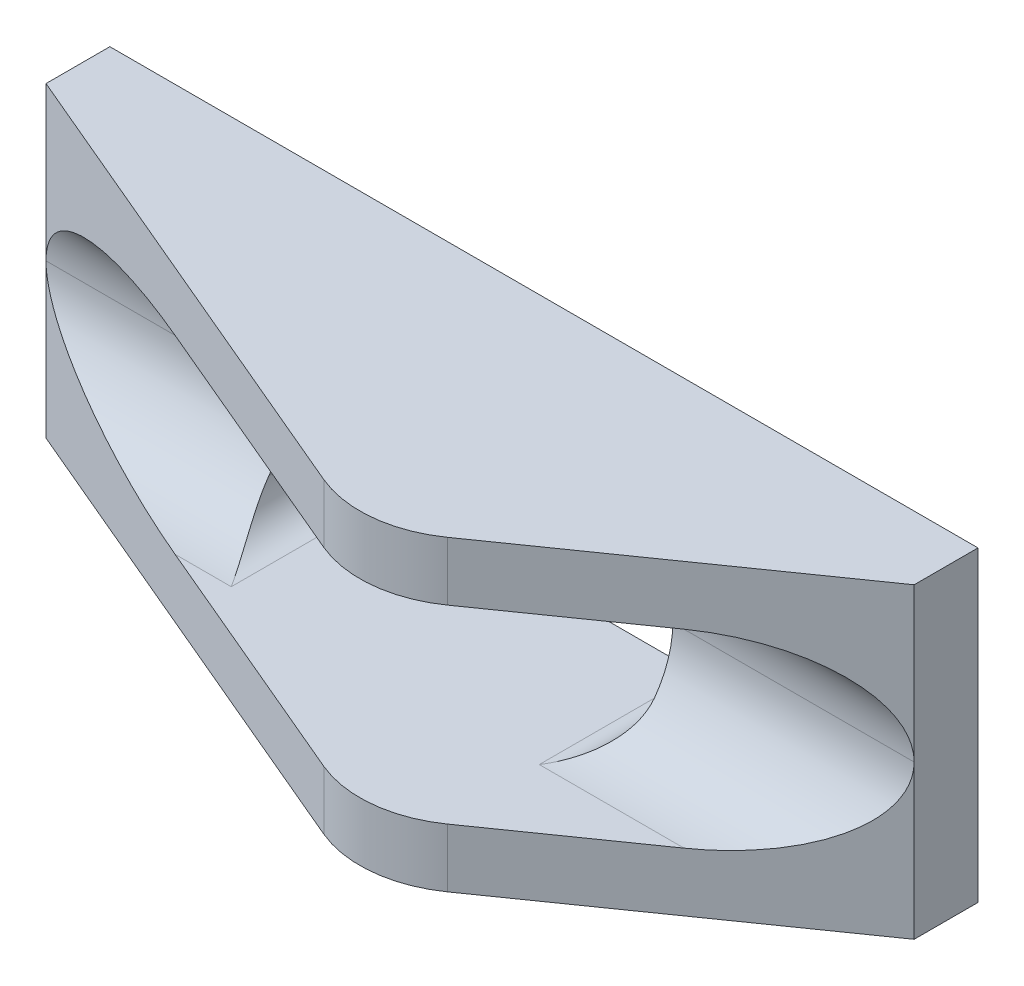
ISO-10303-21;
HEADER;
FILE_DESCRIPTION(('STEP AP214'),'2;1');
FILE_NAME('part.step','',(''),(''),'','','');
FILE_SCHEMA(('AUTOMOTIVE_DESIGN { 1 0 10303 214 1 1 1 1 }'));
ENDSEC;
DATA;
#1=APPLICATION_CONTEXT('core data for automotive mechanical design processes');
#2=APPLICATION_PROTOCOL_DEFINITION('international standard','automotive_design',2000,#1);
#3=PRODUCT_CONTEXT('',#1,'mechanical');
#4=PRODUCT('Part','Part','',(#3));
#5=PRODUCT_RELATED_PRODUCT_CATEGORY('part','',(#4));
#6=PRODUCT_DEFINITION_FORMATION('','',#4);
#7=PRODUCT_DEFINITION_CONTEXT('part definition',#1,'design');
#8=PRODUCT_DEFINITION('design','',#6,#7);
#9=PRODUCT_DEFINITION_SHAPE('','',#8);
#10=(LENGTH_UNIT() NAMED_UNIT(*) SI_UNIT(.MILLI.,.METRE.));
#11=(NAMED_UNIT(*) PLANE_ANGLE_UNIT() SI_UNIT($,.RADIAN.));
#12=(NAMED_UNIT(*) SI_UNIT($,.STERADIAN.) SOLID_ANGLE_UNIT());
#13=UNCERTAINTY_MEASURE_WITH_UNIT(LENGTH_MEASURE(1.E-05),#10,'distance_accuracy_value','');
#14=(GEOMETRIC_REPRESENTATION_CONTEXT(3) GLOBAL_UNCERTAINTY_ASSIGNED_CONTEXT((#13)) GLOBAL_UNIT_ASSIGNED_CONTEXT((#10,
#11,#12)) REPRESENTATION_CONTEXT('',''));
#15=CARTESIAN_POINT('',(0.,0.,0.));
#16=DIRECTION('',(0.,0.,1.));
#17=DIRECTION('',(1.,0.,0.));
#18=AXIS2_PLACEMENT_3D('',#15,#16,#17);
#19=CARTESIAN_POINT('',(0.,0.,-5.99738460468157));
#20=DIRECTION('',(1.,0.,0.));
#21=DIRECTION('',(0.,0.,-1.));
#22=AXIS2_PLACEMENT_3D('',#19,#20,#21);
#23=CYLINDRICAL_SURFACE('',#22,6.223);
#24=CARTESIAN_POINT('',(14.7510273618538,3.68299999999998,-11.013482689847));
#25=CARTESIAN_POINT('',(14.7510192398288,3.77062108702406,-10.9491729691934));
#26=CARTESIAN_POINT('',(14.7464960217351,3.8564633635951,-10.8825882655043));
#27=CARTESIAN_POINT('',(14.7294467336812,4.02394481183231,-10.7455647351371));
#28=CARTESIAN_POINT('',(14.7169349879002,4.10559122451816,-10.6751330128147));
#29=CARTESIAN_POINT('',(14.6850854044515,4.26357503702304,-10.5315834790002));
#30=CARTESIAN_POINT('',(14.6658156078275,4.33995659432102,-10.4584987230804));
#31=CARTESIAN_POINT('',(14.621301757878,4.48808495575234,-10.3094454186469));
#32=CARTESIAN_POINT('',(14.5960541294101,4.55982895350168,-10.2334751673308));
#33=CARTESIAN_POINT('',(14.5292211582923,4.72633143875333,-10.0481430735446));
#34=CARTESIAN_POINT('',(14.4851436261417,4.81878761882573,-9.93760299777665));
#35=CARTESIAN_POINT('',(14.3887158003018,4.99421767099625,-9.71274216603948));
#36=CARTESIAN_POINT('',(14.3363635895779,5.07718933807677,-9.59842053884507));
#37=CARTESIAN_POINT('',(14.1686097935668,5.31298900211726,-9.24959891914482));
#38=CARTESIAN_POINT('',(14.0429378749322,5.45172094746975,-9.01035135337723));
#39=CARTESIAN_POINT('',(13.8134420615749,5.65788943356936,-8.5956322631334));
#40=CARTESIAN_POINT('',(13.7139916473592,5.73430819661466,-8.42199308105781));
#41=CARTESIAN_POINT('',(13.5085078458643,5.87007700161003,-8.07179381515766));
#42=CARTESIAN_POINT('',(13.4024712717605,5.92941870106635,-7.89523234812532));
#43=CARTESIAN_POINT('',(13.1860494183576,6.03145074788007,-7.5405422503233));
#44=CARTESIAN_POINT('',(13.075673043595,6.07417341335729,-7.36241735701683));
#45=CARTESIAN_POINT('',(12.8520063669007,6.14357826112029,-7.00500017017672));
#46=CARTESIAN_POINT('',(12.7387176130706,6.17026878882132,-6.82570853320225));
#47=CARTESIAN_POINT('',(12.5574807493523,6.20018222309766,-6.54032458689748));
#48=CARTESIAN_POINT('',(12.4900280823434,6.20854152605513,-6.43442353797042));
#49=CARTESIAN_POINT('',(12.3548893274787,6.21982819100618,-6.22257084781105));
#50=CARTESIAN_POINT('',(12.2872034434071,6.2227594720158,-6.1166192983677));
#51=CARTESIAN_POINT('',(12.2166901202745,6.2229952651248,-6.00624822384881));
#52=CARTESIAN_POINT('',(12.2138587322994,6.22299999930855,-6.00181640071064));
#53=CARTESIAN_POINT('',(12.2110273618538,6.223,-5.99738460468157));
#54=B_SPLINE_CURVE_WITH_KNOTS('',3,(#24,#25,#26,#27,#28,#29,#30,#31,#32,#33,#34,#35,#36,#37,#38,
#39,#40,#41,#42,#43,#44,#45,#46,#47,#48,#49,#50,#51,#52,#53),.UNSPECIFIED.,.F.,.F.,(4,2,2,2,2,2,
2,2,2,2,2,2,2,2,4),(0.,0.325807359288605,0.651032149844112,0.973072326145553,1.29530559264606,
1.74670408642337,2.19820731155942,3.10578212670607,3.74768048443243,4.38989189232504,
5.03084810812777,5.6714703889397,6.04888277178355,6.4260225575829,6.44179976271333),.UNSPECIFIED.);
#55=CARTESIAN_POINT('',(12.2110273618538,6.223,-5.99738460468157));
#56=VERTEX_POINT('',#55);
#57=CARTESIAN_POINT('',(14.7510273618538,3.68299999999998,-11.013482689847));
#58=VERTEX_POINT('',#57);
#59=EDGE_CURVE('E11',#56,#58,#54,.F.);
#60=ORIENTED_EDGE('',*,*,#59,.T.);
#61=CARTESIAN_POINT('',(14.7510273618538,0.,-5.99738460468157));
#62=DIRECTION('',(1.,0.,0.));
#63=DIRECTION('',(0.,0.,-1.));
#64=AXIS2_PLACEMENT_3D('',#61,#62,#63);
#65=CIRCLE('',#64,6.223);
#66=CARTESIAN_POINT('',(14.7510273618538,0.,-12.2203846046816));
#67=VERTEX_POINT('',#66);
#68=EDGE_CURVE('E259',#58,#67,#65,.F.);
#69=ORIENTED_EDGE('',*,*,#68,.T.);
#70=DIRECTION('',(1.,0.,0.));
#71=VECTOR('',#70,1.);
#72=CARTESIAN_POINT('',(0.,0.,-12.2203846046816));
#73=LINE('',#72,#71);
#74=CARTESIAN_POINT('',(30.5942773618538,0.,-12.2203846046816));
#75=VERTEX_POINT('',#74);
#76=EDGE_CURVE('E280',#75,#67,#73,.F.);
#77=ORIENTED_EDGE('',*,*,#76,.F.);
#78=CARTESIAN_POINT('',(21.7104596303103,0.,-5.99738460468157));
#79=DIRECTION('',(-0.57373008714395,0.,-0.81904443536709));
#80=DIRECTION('',(0.81904443536709,0.,-0.57373008714395));
#81=AXIS2_PLACEMENT_3D('',#78,#79,#80);
#82=ELLIPSE('',#81,10.846563810133,6.223);
#83=CARTESIAN_POINT('',(21.7104596303103,6.223,-5.99738460468157));
#84=VERTEX_POINT('',#83);
#85=EDGE_CURVE('E370',#84,#75,#82,.T.);
#86=ORIENTED_EDGE('',*,*,#85,.F.);
#87=DIRECTION('',(1.,0.,0.));
#88=VECTOR('',#87,1.);
#89=CARTESIAN_POINT('',(0.,6.223,-5.99738460468157));
#90=LINE('',#89,#88);
#91=EDGE_CURVE('E358',#56,#84,#90,.T.);
#92=ORIENTED_EDGE('',*,*,#91,.F.);
#93=EDGE_LOOP('',(#60,#69,#77,#86,#92));
#94=FACE_BOUND('',#93,.T.);
#95=ADVANCED_FACE('F47',(#94),#23,.F.);
#96=CARTESIAN_POINT('',(0.,0.,-5.99738460468157));
#97=DIRECTION('',(-1.,0.,0.));
#98=DIRECTION('',(0.,0.,1.));
#99=AXIS2_PLACEMENT_3D('',#96,#97,#98);
#100=CYLINDRICAL_SURFACE('',#99,6.223);
#101=CARTESIAN_POINT('',(14.7510273618538,0.,-5.99738460468157));
#102=DIRECTION('',(1.,0.,0.));
#103=DIRECTION('',(0.,0.,-1.));
#104=AXIS2_PLACEMENT_3D('',#101,#102,#103);
#105=CIRCLE('',#104,6.223);
#106=CARTESIAN_POINT('',(14.7510273618538,-3.68299999999998,-11.013482689847));
#107=VERTEX_POINT('',#106);
#108=EDGE_CURVE('E410',#67,#107,#105,.F.);
#109=ORIENTED_EDGE('',*,*,#108,.T.);
#110=CARTESIAN_POINT('',(14.7510273618538,-3.68299999999998,-11.013482689847));
#111=CARTESIAN_POINT('',(14.7510192398288,-3.77062108702402,-10.9491729691934));
#112=CARTESIAN_POINT('',(14.7464960217351,-3.856463363595,-10.8825882655044));
#113=CARTESIAN_POINT('',(14.7294467336812,-4.02394481183212,-10.7455647351373));
#114=CARTESIAN_POINT('',(14.7169349879002,-4.10559122451792,-10.6751330128149));
#115=CARTESIAN_POINT('',(14.6850854044515,-4.26357503702282,-10.5315834790004));
#116=CARTESIAN_POINT('',(14.6658156078275,-4.33995659432085,-10.4584987230805));
#117=CARTESIAN_POINT('',(14.621301757878,-4.48808495575226,-10.309445418647));
#118=CARTESIAN_POINT('',(14.5960541294101,-4.55982895350164,-10.2334751673308));
#119=CARTESIAN_POINT('',(14.5292211582923,-4.72633143875337,-10.0481430735446));
#120=CARTESIAN_POINT('',(14.4851436261417,-4.8187876188258,-9.93760299777657));
#121=CARTESIAN_POINT('',(14.3887158003018,-4.99421767099636,-9.71274216603932));
#122=CARTESIAN_POINT('',(14.3363635895778,-5.07718933807691,-9.59842053884488));
#123=CARTESIAN_POINT('',(14.1686097935667,-5.31298900211736,-9.24959891914466));
#124=CARTESIAN_POINT('',(14.0429378749321,-5.4517209474698,-9.01035135337714));
#125=CARTESIAN_POINT('',(13.8134420615749,-5.65788943356935,-8.59563226313344));
#126=CARTESIAN_POINT('',(13.7139916473592,-5.73430819661462,-8.42199308105791));
#127=CARTESIAN_POINT('',(13.5085078458644,-5.87007700160997,-8.0717938151578));
#128=CARTESIAN_POINT('',(13.4024712717608,-5.92941870106628,-7.89523234812544));
#129=CARTESIAN_POINT('',(13.1860494183577,-6.03145074788003,-7.54054225032355));
#130=CARTESIAN_POINT('',(13.0756730435946,-6.07417341335727,-7.36241735701724));
#131=CARTESIAN_POINT('',(12.8520063669011,-6.14357826112028,-7.00500017017649));
#132=CARTESIAN_POINT('',(12.7387176130723,-6.17026878882132,-6.82570853320123));
#133=CARTESIAN_POINT('',(12.5574807493514,-6.20018222309767,-6.54032458689804));
#134=CARTESIAN_POINT('',(12.4900280823406,-6.20854152605514,-6.4344235379722));
#135=CARTESIAN_POINT('',(12.3548893274817,-6.21982819100618,-6.22257084780915));
#136=CARTESIAN_POINT('',(12.2872034434177,-6.22275947201579,-6.11661929836091));
#137=CARTESIAN_POINT('',(12.2166901202754,-6.2229952651248,-6.00624822384825));
#138=CARTESIAN_POINT('',(12.2138587322999,-6.22299999930855,-6.00181640071035));
#139=CARTESIAN_POINT('',(12.2110273618538,-6.223,-5.99738460468157));
#140=B_SPLINE_CURVE_WITH_KNOTS('',3,(#110,#111,#112,#113,#114,#115,#116,#117,#118,#119,#120,
#121,#122,#123,#124,#125,#126,#127,#128,#129,#130,#131,#132,#133,#134,#135,#136,#137,#138,#139),
.UNSPECIFIED.,.F.,.F.,(4,2,2,2,2,2,2,2,2,2,2,2,2,2,4),(0.,0.32580735928841,0.651032149843723,
0.973072326145361,1.29530559264606,1.74670408642352,2.19820731155972,3.10578212670607,
3.74768048443227,4.38989189232474,5.03084810812765,5.67147038893971,6.04888277178356,
6.42602255758289,6.44179976271333),.UNSPECIFIED.);
#141=CARTESIAN_POINT('',(12.2110273618538,-6.223,-5.99738460468157));
#142=VERTEX_POINT('',#141);
#143=EDGE_CURVE('E403',#107,#142,#140,.T.);
#144=ORIENTED_EDGE('',*,*,#143,.T.);
#145=DIRECTION('',(1.,0.,0.));
#146=VECTOR('',#145,1.);
#147=CARTESIAN_POINT('',(-26.3906226381462,-6.223,-5.99738460468157));
#148=LINE('',#147,#146);
#149=CARTESIAN_POINT('',(21.7104596303103,-6.223,-5.99738460468157));
#150=VERTEX_POINT('',#149);
#151=EDGE_CURVE('E355',#150,#142,#148,.F.);
#152=ORIENTED_EDGE('',*,*,#151,.F.);
#153=CARTESIAN_POINT('',(21.7104596303103,0.,-5.99738460468157));
#154=DIRECTION('',(-0.57373008714395,0.,-0.81904443536709));
#155=DIRECTION('',(-0.81904443536709,0.,0.57373008714395));
#156=AXIS2_PLACEMENT_3D('',#153,#154,#155);
#157=ELLIPSE('',#156,10.846563810133,6.223);
#158=EDGE_CURVE('E363',#75,#150,#157,.T.);
#159=ORIENTED_EDGE('',*,*,#158,.F.);
#160=ORIENTED_EDGE('',*,*,#76,.T.);
#161=EDGE_LOOP('',(#109,#144,#152,#159,#160));
#162=FACE_BOUND('',#161,.T.);
#163=ADVANCED_FACE('F398',(#162),#100,.F.);
#164=CARTESIAN_POINT('',(0.374754533700996,10.07745,-0.884869008015571));
#165=DIRECTION('',(0.389981438118863,0.,-0.920822717966245));
#166=DIRECTION('',(-0.920822717966245,0.,-0.389981438118863));
#167=AXIS2_PLACEMENT_3D('',#164,#165,#166);
#168=PLANE('',#167);
#169=DIRECTION('',(0.920822717966245,0.,0.389981438118863));
#170=VECTOR('',#169,1.);
#171=CARTESIAN_POINT('',(0.374754533700996,-6.223,-0.884869008015571));
#172=LINE('',#171,#170);
#173=CARTESIAN_POINT('',(-11.6968982354032,-6.223,-5.99738460468158));
#174=VERTEX_POINT('',#173);
#175=CARTESIAN_POINT('',(5.23632134698163,-6.223,1.17407326215507));
#176=VERTEX_POINT('',#175);
#177=EDGE_CURVE('E264',#174,#176,#172,.T.);
#178=ORIENTED_EDGE('',*,*,#177,.F.);
#179=CARTESIAN_POINT('',(-11.6968982354032,0.,-5.99738460468157));
#180=DIRECTION('',(0.389981438118863,0.,-0.920822717966245));
#181=DIRECTION('',(-0.920822717966245,0.,-0.389981438118863));
#182=AXIS2_PLACEMENT_3D('',#179,#180,#181);
#183=ELLIPSE('',#182,15.9571697309944,6.223);
#184=CARTESIAN_POINT('',(-26.3906226381462,0.,-12.2203846046816));
#185=VERTEX_POINT('',#184);
#186=EDGE_CURVE('E366',#174,#185,#183,.T.);
#187=ORIENTED_EDGE('',*,*,#186,.T.);
#188=DIRECTION('',(0.,-1.,0.));
#189=VECTOR('',#188,1.);
#190=CARTESIAN_POINT('',(-26.3906226381462,10.07745,-12.2203846046816));
#191=LINE('',#190,#189);
#192=CARTESIAN_POINT('',(-26.3906226381462,-10.07745,-12.2203846046816));
#193=VERTEX_POINT('',#192);
#194=EDGE_CURVE('E349',#185,#193,#191,.T.);
#195=ORIENTED_EDGE('',*,*,#194,.T.);
#196=DIRECTION('',(0.920822717966245,0.,0.389981438118863));
#197=VECTOR('',#196,1.);
#198=CARTESIAN_POINT('',(0.374754533700996,-10.07745,-0.884869008015571));
#199=LINE('',#198,#197);
#200=CARTESIAN_POINT('',(5.23632134698163,-10.07745,1.17407326215507));
#201=VERTEX_POINT('',#200);
#202=EDGE_CURVE('E311',#193,#201,#199,.T.);
#203=ORIENTED_EDGE('',*,*,#202,.T.);
#204=DIRECTION('',(0.,-1.,0.));
#205=VECTOR('',#204,1.);
#206=CARTESIAN_POINT('',(5.23632134698163,10.07745,1.17407326215507));
#207=LINE('',#206,#205);
#208=EDGE_CURVE('E344',#176,#201,#207,.T.);
#209=ORIENTED_EDGE('',*,*,#208,.F.);
#210=EDGE_LOOP('',(#178,#187,#195,#203,#209));
#211=FACE_BOUND('',#210,.T.);
#212=ADVANCED_FACE('F454',(#211),#168,.F.);
#213=CARTESIAN_POINT('',(8.2079799054474,10.07745,-5.8425958487477));
#214=DIRECTION('',(0.,-1.,0.));
#215=DIRECTION('',(0.,0.,-1.));
#216=AXIS2_PLACEMENT_3D('',#213,#214,#215);
#217=CYLINDRICAL_SURFACE('',#216,7.62);
#218=CARTESIAN_POINT('',(8.2079799054474,-6.223,-5.8425958487477));
#219=DIRECTION('',(0.,1.,0.));
#220=DIRECTION('',(0.,0.,1.));
#221=AXIS2_PLACEMENT_3D('',#218,#219,#220);
#222=CIRCLE('',#221,7.62);
#223=CARTESIAN_POINT('',(12.5798031694843,-6.223,0.398522748749506));
#224=VERTEX_POINT('',#223);
#225=EDGE_CURVE('E267',#176,#224,#222,.T.);
#226=ORIENTED_EDGE('',*,*,#225,.F.);
#227=ORIENTED_EDGE('',*,*,#208,.T.);
#228=CARTESIAN_POINT('',(8.2079799054474,-10.07745,-5.8425958487477));
#229=DIRECTION('',(0.,1.,0.));
#230=DIRECTION('',(0.,0.,1.));
#231=AXIS2_PLACEMENT_3D('',#228,#229,#230);
#232=CIRCLE('',#231,7.62);
#233=CARTESIAN_POINT('',(12.5798031694843,-10.07745,0.398522748749506));
#234=VERTEX_POINT('',#233);
#235=EDGE_CURVE('E315',#201,#234,#232,.T.);
#236=ORIENTED_EDGE('',*,*,#235,.T.);
#237=DIRECTION('',(0.,-1.,0.));
#238=VECTOR('',#237,1.);
#239=CARTESIAN_POINT('',(12.5798031694843,10.07745,0.398522748749506));
#240=LINE('',#239,#238);
#241=EDGE_CURVE('E339',#224,#234,#240,.T.);
#242=ORIENTED_EDGE('',*,*,#241,.F.);
#243=EDGE_LOOP('',(#226,#227,#236,#242));
#244=FACE_BOUND('',#243,.T.);
#245=ADVANCED_FACE('F451',(#244),#217,.T.);
#246=CARTESIAN_POINT('',(4.3281161665867,10.07745,6.17872330787448));
#247=DIRECTION('',(-0.57373008714395,0.,-0.81904443536709));
#248=DIRECTION('',(-0.81904443536709,0.,0.57373008714395));
#249=AXIS2_PLACEMENT_3D('',#246,#247,#248);
#250=PLANE('',#249);
#251=DIRECTION('',(0.81904443536709,0.,-0.57373008714395));
#252=VECTOR('',#251,1.);
#253=CARTESIAN_POINT('',(4.3281161665867,-6.223,6.17872330787448));
#254=LINE('',#253,#252);
#255=EDGE_CURVE('E271',#224,#150,#254,.T.);
#256=ORIENTED_EDGE('',*,*,#255,.F.);
#257=ORIENTED_EDGE('',*,*,#241,.T.);
#258=DIRECTION('',(0.81904443536709,0.,-0.57373008714395));
#259=VECTOR('',#258,1.);
#260=CARTESIAN_POINT('',(4.3281161665867,-10.07745,6.17872330787448));
#261=LINE('',#260,#259);
#262=CARTESIAN_POINT('',(30.5942773618538,-10.07745,-12.2203846046816));
#263=VERTEX_POINT('',#262);
#264=EDGE_CURVE('E319',#234,#263,#261,.T.);
#265=ORIENTED_EDGE('',*,*,#264,.T.);
#266=DIRECTION('',(0.,-1.,0.));
#267=VECTOR('',#266,1.);
#268=CARTESIAN_POINT('',(30.5942773618538,10.07745,-12.2203846046816));
#269=LINE('',#268,#267);
#270=EDGE_CURVE('E335',#75,#263,#269,.T.);
#271=ORIENTED_EDGE('',*,*,#270,.F.);
#272=ORIENTED_EDGE('',*,*,#158,.T.);
#273=EDGE_LOOP('',(#256,#257,#265,#271,#272));
#274=FACE_BOUND('',#273,.T.);
#275=ADVANCED_FACE('F447',(#274),#250,.F.);
#276=CARTESIAN_POINT('',(-26.3906226381462,10.07745,0.));
#277=DIRECTION('',(-1.,0.,0.));
#278=DIRECTION('',(0.,0.,1.));
#279=AXIS2_PLACEMENT_3D('',#276,#277,#278);
#280=PLANE('',#279);
#281=DIRECTION('',(0.,0.,-1.));
#282=VECTOR('',#281,1.);
#283=CARTESIAN_POINT('',(-26.3906226381462,-10.07745,0.));
#284=LINE('',#283,#282);
#285=CARTESIAN_POINT('',(-26.3906226381462,-10.07745,-16.4113846046816));
#286=VERTEX_POINT('',#285);
#287=EDGE_CURVE('E275',#193,#286,#284,.T.);
#288=ORIENTED_EDGE('',*,*,#287,.F.);
#289=ORIENTED_EDGE('',*,*,#194,.F.);
#290=CARTESIAN_POINT('',(-26.3906226381462,10.07745,-12.2203846046816));
#291=VERTEX_POINT('',#290);
#292=EDGE_CURVE('E350',#291,#185,#191,.T.);
#293=ORIENTED_EDGE('',*,*,#292,.F.);
#294=DIRECTION('',(0.,0.,-1.));
#295=VECTOR('',#294,1.);
#296=CARTESIAN_POINT('',(-26.3906226381462,10.07745,0.));
#297=LINE('',#296,#295);
#298=CARTESIAN_POINT('',(-26.3906226381462,10.07745,-16.4113846046816));
#299=VERTEX_POINT('',#298);
#300=EDGE_CURVE('E286',#291,#299,#297,.T.);
#301=ORIENTED_EDGE('',*,*,#300,.T.);
#302=DIRECTION('',(0.,-1.,0.));
#303=VECTOR('',#302,1.);
#304=CARTESIAN_POINT('',(-26.3906226381462,10.07745,-16.4113846046816));
#305=LINE('',#304,#303);
#306=EDGE_CURVE('E307',#299,#286,#305,.T.);
#307=ORIENTED_EDGE('',*,*,#306,.T.);
#308=EDGE_LOOP('',(#288,#289,#293,#301,#307));
#309=FACE_BOUND('',#308,.T.);
#310=ADVANCED_FACE('F399',(#309),#280,.T.);
#311=ORIENTED_EDGE('',*,*,#292,.T.);
#312=CARTESIAN_POINT('',(-11.6968982354032,0.,-5.99738460468157));
#313=DIRECTION('',(0.389981438118863,0.,-0.920822717966245));
#314=DIRECTION('',(0.920822717966245,0.,0.389981438118863));
#315=AXIS2_PLACEMENT_3D('',#312,#313,#314);
#316=ELLIPSE('',#315,15.9571697309944,6.223);
#317=CARTESIAN_POINT('',(-11.6968982354032,6.223,-5.99738460468158));
#318=VERTEX_POINT('',#317);
#319=EDGE_CURVE('E374',#185,#318,#316,.T.);
#320=ORIENTED_EDGE('',*,*,#319,.T.);
#321=DIRECTION('',(0.920822717966245,0.,0.389981438118863));
#322=VECTOR('',#321,1.);
#323=CARTESIAN_POINT('',(0.374754533700996,6.223,-0.884869008015571));
#324=LINE('',#323,#322);
#325=CARTESIAN_POINT('',(5.23632134698163,6.223,1.17407326215507));
#326=VERTEX_POINT('',#325);
#327=EDGE_CURVE('E276',#318,#326,#324,.T.);
#328=ORIENTED_EDGE('',*,*,#327,.T.);
#329=CARTESIAN_POINT('',(5.23632134698163,10.07745,1.17407326215507));
#330=VERTEX_POINT('',#329);
#331=EDGE_CURVE('E345',#330,#326,#207,.T.);
#332=ORIENTED_EDGE('',*,*,#331,.F.);
#333=DIRECTION('',(0.920822717966245,0.,0.389981438118863));
#334=VECTOR('',#333,1.);
#335=CARTESIAN_POINT('',(0.374754533700996,10.07745,-0.884869008015571));
#336=LINE('',#335,#334);
#337=EDGE_CURVE('E290',#291,#330,#336,.T.);
#338=ORIENTED_EDGE('',*,*,#337,.F.);
#339=EDGE_LOOP('',(#311,#320,#328,#332,#338));
#340=FACE_BOUND('',#339,.T.);
#341=ADVANCED_FACE('F449',(#340),#168,.F.);
#342=ORIENTED_EDGE('',*,*,#331,.T.);
#343=CARTESIAN_POINT('',(8.2079799054474,6.223,-5.8425958487477));
#344=DIRECTION('',(0.,1.,0.));
#345=DIRECTION('',(0.,0.,1.));
#346=AXIS2_PLACEMENT_3D('',#343,#344,#345);
#347=CIRCLE('',#346,7.62);
#348=CARTESIAN_POINT('',(12.5798031694843,6.223,0.398522748749506));
#349=VERTEX_POINT('',#348);
#350=EDGE_CURVE('E279',#326,#349,#347,.T.);
#351=ORIENTED_EDGE('',*,*,#350,.T.);
#352=CARTESIAN_POINT('',(12.5798031694843,10.07745,0.398522748749506));
#353=VERTEX_POINT('',#352);
#354=EDGE_CURVE('E340',#353,#349,#240,.T.);
#355=ORIENTED_EDGE('',*,*,#354,.F.);
#356=CARTESIAN_POINT('',(8.2079799054474,10.07745,-5.8425958487477));
#357=DIRECTION('',(0.,1.,0.));
#358=DIRECTION('',(0.,0.,1.));
#359=AXIS2_PLACEMENT_3D('',#356,#357,#358);
#360=CIRCLE('',#359,7.62);
#361=EDGE_CURVE('E294',#330,#353,#360,.T.);
#362=ORIENTED_EDGE('',*,*,#361,.F.);
#363=EDGE_LOOP('',(#342,#351,#355,#362));
#364=FACE_BOUND('',#363,.T.);
#365=ADVANCED_FACE('F445',(#364),#217,.T.);
#366=ORIENTED_EDGE('',*,*,#354,.T.);
#367=DIRECTION('',(0.81904443536709,0.,-0.57373008714395));
#368=VECTOR('',#367,1.);
#369=CARTESIAN_POINT('',(4.3281161665867,6.223,6.17872330787448));
#370=LINE('',#369,#368);
#371=EDGE_CURVE('E268',#349,#84,#370,.T.);
#372=ORIENTED_EDGE('',*,*,#371,.T.);
#373=ORIENTED_EDGE('',*,*,#85,.T.);
#374=CARTESIAN_POINT('',(30.5942773618538,10.07745,-12.2203846046816));
#375=VERTEX_POINT('',#374);
#376=EDGE_CURVE('E336',#375,#75,#269,.T.);
#377=ORIENTED_EDGE('',*,*,#376,.F.);
#378=DIRECTION('',(0.81904443536709,0.,-0.57373008714395));
#379=VECTOR('',#378,1.);
#380=CARTESIAN_POINT('',(4.3281161665867,10.07745,6.17872330787448));
#381=LINE('',#380,#379);
#382=EDGE_CURVE('E297',#353,#375,#381,.T.);
#383=ORIENTED_EDGE('',*,*,#382,.F.);
#384=EDGE_LOOP('',(#366,#372,#373,#377,#383));
#385=FACE_BOUND('',#384,.T.);
#386=ADVANCED_FACE('F441',(#385),#250,.F.);
#387=CARTESIAN_POINT('',(30.5942773618538,10.07745,0.));
#388=DIRECTION('',(-1.,0.,0.));
#389=DIRECTION('',(0.,0.,1.));
#390=AXIS2_PLACEMENT_3D('',#387,#388,#389);
#391=PLANE('',#390);
#392=DIRECTION('',(0.,0.,-1.));
#393=VECTOR('',#392,1.);
#394=CARTESIAN_POINT('',(30.5942773618538,-10.07745,0.));
#395=LINE('',#394,#393);
#396=CARTESIAN_POINT('',(30.5942773618538,-10.07745,-16.4113846046816));
#397=VERTEX_POINT('',#396);
#398=EDGE_CURVE('E323',#263,#397,#395,.T.);
#399=ORIENTED_EDGE('',*,*,#398,.T.);
#400=DIRECTION('',(0.,-1.,0.));
#401=VECTOR('',#400,1.);
#402=CARTESIAN_POINT('',(30.5942773618538,10.07745,-16.4113846046816));
#403=LINE('',#402,#401);
#404=CARTESIAN_POINT('',(30.5942773618538,10.07745,-16.4113846046816));
#405=VERTEX_POINT('',#404);
#406=EDGE_CURVE('E332',#405,#397,#403,.T.);
#407=ORIENTED_EDGE('',*,*,#406,.F.);
#408=DIRECTION('',(0.,0.,-1.));
#409=VECTOR('',#408,1.);
#410=CARTESIAN_POINT('',(30.5942773618538,10.07745,0.));
#411=LINE('',#410,#409);
#412=EDGE_CURVE('E300',#375,#405,#411,.T.);
#413=ORIENTED_EDGE('',*,*,#412,.F.);
#414=ORIENTED_EDGE('',*,*,#376,.T.);
#415=ORIENTED_EDGE('',*,*,#270,.T.);
#416=EDGE_LOOP('',(#399,#407,#413,#414,#415));
#417=FACE_BOUND('',#416,.T.);
#418=ADVANCED_FACE('F438',(#417),#391,.F.);
#419=CARTESIAN_POINT('',(0.,10.07745,-16.4113846046816));
#420=DIRECTION('',(0.,0.,-1.));
#421=DIRECTION('',(-1.,0.,0.));
#422=AXIS2_PLACEMENT_3D('',#419,#420,#421);
#423=PLANE('',#422);
#424=CARTESIAN_POINT('',(12.2110273618538,-3.683,-16.4113846046816));
#425=DIRECTION('',(0.,0.,-1.));
#426=DIRECTION('',(1.,0.,0.));
#427=AXIS2_PLACEMENT_3D('',#424,#425,#426);
#428=CIRCLE('',#427,2.54);
#429=CARTESIAN_POINT('',(14.7510273618538,-3.68299999999998,-16.4113846046816));
#430=VERTEX_POINT('',#429);
#431=CARTESIAN_POINT('',(12.2110273618538,-6.223,-16.4113846046816));
#432=VERTEX_POINT('',#431);
#433=EDGE_CURVE('E69',#430,#432,#428,.T.);
#434=ORIENTED_EDGE('',*,*,#433,.F.);
#435=DIRECTION('',(0.,-1.,0.));
#436=VECTOR('',#435,1.);
#437=CARTESIAN_POINT('',(14.7510273618538,-3.68299999999998,-16.4113846046816));
#438=LINE('',#437,#436);
#439=CARTESIAN_POINT('',(14.7510273618538,3.68299999999998,-16.4113846046816));
#440=VERTEX_POINT('',#439);
#441=EDGE_CURVE('E232',#440,#430,#438,.T.);
#442=ORIENTED_EDGE('',*,*,#441,.F.);
#443=CARTESIAN_POINT('',(12.2110273618538,3.683,-16.4113846046816));
#444=DIRECTION('',(0.,0.,-1.));
#445=DIRECTION('',(1.,0.,0.));
#446=AXIS2_PLACEMENT_3D('',#443,#444,#445);
#447=CIRCLE('',#446,2.54);
#448=CARTESIAN_POINT('',(12.2110273618538,6.223,-16.4113846046816));
#449=VERTEX_POINT('',#448);
#450=EDGE_CURVE('E228',#449,#440,#447,.T.);
#451=ORIENTED_EDGE('',*,*,#450,.F.);
#452=DIRECTION('',(1.,0.,0.));
#453=VECTOR('',#452,1.);
#454=CARTESIAN_POINT('',(12.2110273618538,6.223,-16.4113846046816));
#455=LINE('',#454,#453);
#456=CARTESIAN_POINT('',(-8.00737263814615,6.223,-16.4113846046816));
#457=VERTEX_POINT('',#456);
#458=EDGE_CURVE('E224',#457,#449,#455,.T.);
#459=ORIENTED_EDGE('',*,*,#458,.F.);
#460=CARTESIAN_POINT('',(-8.00737263814617,3.683,-16.4113846046816));
#461=DIRECTION('',(0.,0.,-1.));
#462=DIRECTION('',(1.,0.,0.));
#463=AXIS2_PLACEMENT_3D('',#460,#461,#462);
#464=CIRCLE('',#463,2.54);
#465=CARTESIAN_POINT('',(-10.5473726381462,3.68299999999998,-16.4113846046816));
#466=VERTEX_POINT('',#465);
#467=EDGE_CURVE('E217',#466,#457,#464,.T.);
#468=ORIENTED_EDGE('',*,*,#467,.F.);
#469=DIRECTION('',(0.,1.,0.));
#470=VECTOR('',#469,1.);
#471=CARTESIAN_POINT('',(-10.5473726381462,-3.68299999999998,-16.4113846046816));
#472=LINE('',#471,#470);
#473=CARTESIAN_POINT('',(-10.5473726381462,-3.683,-16.4113846046816));
#474=VERTEX_POINT('',#473);
#475=EDGE_CURVE('E213',#474,#466,#472,.T.);
#476=ORIENTED_EDGE('',*,*,#475,.F.);
#477=CARTESIAN_POINT('',(-8.00737263814617,-3.683,-16.4113846046816));
#478=DIRECTION('',(0.,0.,-1.));
#479=DIRECTION('',(-1.,0.,0.));
#480=AXIS2_PLACEMENT_3D('',#477,#478,#479);
#481=CIRCLE('',#480,2.54);
#482=CARTESIAN_POINT('',(-8.00737263814615,-6.223,-16.4113846046816));
#483=VERTEX_POINT('',#482);
#484=EDGE_CURVE('E193',#483,#474,#481,.T.);
#485=ORIENTED_EDGE('',*,*,#484,.F.);
#486=DIRECTION('',(-1.,0.,0.));
#487=VECTOR('',#486,1.);
#488=CARTESIAN_POINT('',(12.2110273618538,-6.223,-16.4113846046816));
#489=LINE('',#488,#487);
#490=EDGE_CURVE('E203',#432,#483,#489,.T.);
#491=ORIENTED_EDGE('',*,*,#490,.F.);
#492=EDGE_LOOP('',(#434,#442,#451,#459,#468,#476,#485,#491));
#493=FACE_BOUND('',#492,.T.);
#494=DIRECTION('',(1.,0.,0.));
#495=VECTOR('',#494,1.);
#496=CARTESIAN_POINT('',(0.,-10.07745,-16.4113846046816));
#497=LINE('',#496,#495);
#498=EDGE_CURVE('E291',#286,#397,#497,.T.);
#499=ORIENTED_EDGE('',*,*,#498,.F.);
#500=ORIENTED_EDGE('',*,*,#306,.F.);
#501=DIRECTION('',(1.,0.,0.));
#502=VECTOR('',#501,1.);
#503=CARTESIAN_POINT('',(0.,10.07745,-16.4113846046816));
#504=LINE('',#503,#502);
#505=EDGE_CURVE('E303',#299,#405,#504,.T.);
#506=ORIENTED_EDGE('',*,*,#505,.T.);
#507=ORIENTED_EDGE('',*,*,#406,.T.);
#508=EDGE_LOOP('',(#499,#500,#506,#507));
#509=FACE_BOUND('',#508,.T.);
#510=ADVANCED_FACE('F209',(#493,#509),#423,.T.);
#511=CARTESIAN_POINT('',(0.,10.07745,0.));
#512=DIRECTION('',(0.,1.,0.));
#513=DIRECTION('',(0.,0.,1.));
#514=AXIS2_PLACEMENT_3D('',#511,#512,#513);
#515=PLANE('',#514);
#516=ORIENTED_EDGE('',*,*,#300,.F.);
#517=ORIENTED_EDGE('',*,*,#337,.T.);
#518=ORIENTED_EDGE('',*,*,#361,.T.);
#519=ORIENTED_EDGE('',*,*,#382,.T.);
#520=ORIENTED_EDGE('',*,*,#412,.T.);
#521=ORIENTED_EDGE('',*,*,#505,.F.);
#522=EDGE_LOOP('',(#516,#517,#518,#519,#520,#521));
#523=FACE_BOUND('',#522,.T.);
#524=ADVANCED_FACE('F429',(#523),#515,.T.);
#525=CARTESIAN_POINT('',(0.,-10.07745,0.));
#526=DIRECTION('',(0.,1.,0.));
#527=DIRECTION('',(0.,0.,1.));
#528=AXIS2_PLACEMENT_3D('',#525,#526,#527);
#529=PLANE('',#528);
#530=ORIENTED_EDGE('',*,*,#287,.T.);
#531=ORIENTED_EDGE('',*,*,#498,.T.);
#532=ORIENTED_EDGE('',*,*,#398,.F.);
#533=ORIENTED_EDGE('',*,*,#264,.F.);
#534=ORIENTED_EDGE('',*,*,#235,.F.);
#535=ORIENTED_EDGE('',*,*,#202,.F.);
#536=EDGE_LOOP('',(#530,#531,#532,#533,#534,#535));
#537=FACE_BOUND('',#536,.T.);
#538=ADVANCED_FACE('F425',(#537),#529,.F.);
#539=CARTESIAN_POINT('',(0.,-6.223,0.));
#540=DIRECTION('',(0.,1.,0.));
#541=DIRECTION('',(0.,0.,1.));
#542=AXIS2_PLACEMENT_3D('',#539,#540,#541);
#543=PLANE('',#542);
#544=ORIENTED_EDGE('',*,*,#151,.T.);
#545=DIRECTION('',(0.,0.,-1.));
#546=VECTOR('',#545,1.);
#547=CARTESIAN_POINT('',(12.2110273618538,-6.223,1.7774041512523));
#548=LINE('',#547,#546);
#549=EDGE_CURVE('E200',#142,#432,#548,.T.);
#550=ORIENTED_EDGE('',*,*,#549,.T.);
#551=ORIENTED_EDGE('',*,*,#490,.T.);
#552=DIRECTION('',(0.,0.,-1.));
#553=VECTOR('',#552,1.);
#554=CARTESIAN_POINT('',(-8.00737263814615,-6.223,1.7774041512523));
#555=LINE('',#554,#553);
#556=CARTESIAN_POINT('',(-8.00737263814616,-6.223,-5.99738460468157));
#557=VERTEX_POINT('',#556);
#558=EDGE_CURVE('E77',#557,#483,#555,.T.);
#559=ORIENTED_EDGE('',*,*,#558,.F.);
#560=EDGE_CURVE('E354',#557,#174,#148,.F.);
#561=ORIENTED_EDGE('',*,*,#560,.T.);
#562=ORIENTED_EDGE('',*,*,#177,.T.);
#563=ORIENTED_EDGE('',*,*,#225,.T.);
#564=ORIENTED_EDGE('',*,*,#255,.T.);
#565=EDGE_LOOP('',(#544,#550,#551,#559,#561,#562,#563,#564));
#566=FACE_BOUND('',#565,.T.);
#567=ADVANCED_FACE('F205',(#566),#543,.T.);
#568=CARTESIAN_POINT('',(0.,6.223,0.));
#569=DIRECTION('',(0.,1.,0.));
#570=DIRECTION('',(0.,0.,1.));
#571=AXIS2_PLACEMENT_3D('',#568,#569,#570);
#572=PLANE('',#571);
#573=ORIENTED_EDGE('',*,*,#371,.F.);
#574=ORIENTED_EDGE('',*,*,#350,.F.);
#575=ORIENTED_EDGE('',*,*,#327,.F.);
#576=CARTESIAN_POINT('',(-8.00737263814615,6.223,-5.99738460468157));
#577=VERTEX_POINT('',#576);
#578=EDGE_CURVE('E359',#318,#577,#90,.T.);
#579=ORIENTED_EDGE('',*,*,#578,.T.);
#580=DIRECTION('',(0.,0.,-1.));
#581=VECTOR('',#580,1.);
#582=CARTESIAN_POINT('',(-8.00737263814615,6.223,1.7774041512523));
#583=LINE('',#582,#581);
#584=EDGE_CURVE('E246',#577,#457,#583,.T.);
#585=ORIENTED_EDGE('',*,*,#584,.T.);
#586=ORIENTED_EDGE('',*,*,#458,.T.);
#587=DIRECTION('',(0.,0.,-1.));
#588=VECTOR('',#587,1.);
#589=CARTESIAN_POINT('',(12.2110273618538,6.223,1.7774041512523));
#590=LINE('',#589,#588);
#591=EDGE_CURVE('E243',#56,#449,#590,.T.);
#592=ORIENTED_EDGE('',*,*,#591,.F.);
#593=ORIENTED_EDGE('',*,*,#91,.T.);
#594=EDGE_LOOP('',(#573,#574,#575,#579,#585,#586,#592,#593));
#595=FACE_BOUND('',#594,.T.);
#596=ADVANCED_FACE('F424',(#595),#572,.F.);
#597=CARTESIAN_POINT('',(-10.5473726381462,0.,-5.99738460468157));
#598=DIRECTION('',(-1.,0.,0.));
#599=DIRECTION('',(0.,0.,1.));
#600=AXIS2_PLACEMENT_3D('',#597,#598,#599);
#601=CIRCLE('',#600,6.223);
#602=CARTESIAN_POINT('',(-10.5473726381462,0.,-12.2203846046816));
#603=VERTEX_POINT('',#602);
#604=CARTESIAN_POINT('',(-10.5473726381462,3.68299999999998,-11.013482689847));
#605=VERTEX_POINT('',#604);
#606=EDGE_CURVE('E239',#603,#605,#601,.F.);
#607=ORIENTED_EDGE('',*,*,#606,.T.);
#608=CARTESIAN_POINT('',(-10.5473726381462,3.68299999999998,-11.013482689847));
#609=CARTESIAN_POINT('',(-10.5473645161212,3.77062108702407,-10.9491729691934));
#610=CARTESIAN_POINT('',(-10.5428412980275,3.8564633635951,-10.8825882655043));
#611=CARTESIAN_POINT('',(-10.5257920099735,4.02394481183232,-10.7455647351371));
#612=CARTESIAN_POINT('',(-10.5132802641925,4.10559122451817,-10.6751330128147));
#613=CARTESIAN_POINT('',(-10.4814306807438,4.26357503702306,-10.5315834790002));
#614=CARTESIAN_POINT('',(-10.4621608841198,4.33995659432103,-10.4584987230804));
#615=CARTESIAN_POINT('',(-10.4176470341703,4.48808495575234,-10.3094454186469));
#616=CARTESIAN_POINT('',(-10.3923994057025,4.55982895350168,-10.2334751673308));
#617=CARTESIAN_POINT('',(-10.3255664345846,4.72633143875332,-10.0481430735446));
#618=CARTESIAN_POINT('',(-10.2814889024341,4.81878761882573,-9.93760299777666));
#619=CARTESIAN_POINT('',(-10.1850610765942,4.99421767099624,-9.71274216603949));
#620=CARTESIAN_POINT('',(-10.1327088658703,5.07718933807676,-9.59842053884509));
#621=CARTESIAN_POINT('',(-9.96495506985917,5.31298900211726,-9.24959891914484));
#622=CARTESIAN_POINT('',(-9.8392831512245,5.45172094746975,-9.01035135337724));
#623=CARTESIAN_POINT('',(-9.60978733786722,5.65788943356936,-8.5956322631334));
#624=CARTESIAN_POINT('',(-9.51033692365151,5.73430819661466,-8.42199308105781));
#625=CARTESIAN_POINT('',(-9.30485312215661,5.87007700161003,-8.07179381515765));
#626=CARTESIAN_POINT('',(-9.19881654805288,5.92941870106635,-7.89523234812531));
#627=CARTESIAN_POINT('',(-8.98239469464999,6.03145074788007,-7.54054225032329));
#628=CARTESIAN_POINT('',(-8.87201831988734,6.07417341335729,-7.36241735701681));
#629=CARTESIAN_POINT('',(-8.64835164319298,6.14357826112029,-7.00500017017674));
#630=CARTESIAN_POINT('',(-8.53506288936288,6.17026878882132,-6.82570853320232));
#631=CARTESIAN_POINT('',(-8.35382602564473,6.20018222309766,-6.54032458689745));
#632=CARTESIAN_POINT('',(-8.28637335863596,6.20854152605513,-6.43442353797032));
#633=CARTESIAN_POINT('',(-8.15123460377092,6.21982819100618,-6.22257084781116));
#634=CARTESIAN_POINT('',(-8.08354871969883,6.2227594720158,-6.11661929836809));
#635=CARTESIAN_POINT('',(-8.01303539656684,6.2229952651248,-6.00624822384884));
#636=CARTESIAN_POINT('',(-8.01020400859177,6.22299999930855,-6.00181640071066));
#637=CARTESIAN_POINT('',(-8.00737263814617,6.223,-5.99738460468157));
#638=B_SPLINE_CURVE_WITH_KNOTS('',3,(#608,#609,#610,#611,#612,#613,#614,#615,#616,#617,#618,
#619,#620,#621,#622,#623,#624,#625,#626,#627,#628,#629,#630,#631,#632,#633,#634,#635,#636,#637),
.UNSPECIFIED.,.F.,.F.,(4,2,2,2,2,2,2,2,2,2,2,2,2,2,4),(0.,0.325807359288617,0.651032149844134,
0.973072326145564,1.29530559264606,1.74670408642336,2.1982073115594,3.10578212670607,
3.74768048443244,4.38989189232505,5.03084810812777,5.67147038893969,6.04888277178354,
6.4260225575829,6.44179976271333),.UNSPECIFIED.);
#639=EDGE_CURVE('E62',#605,#577,#638,.T.);
#640=ORIENTED_EDGE('',*,*,#639,.T.);
#641=ORIENTED_EDGE('',*,*,#578,.F.);
#642=ORIENTED_EDGE('',*,*,#319,.F.);
#643=EDGE_CURVE('E263',#603,#185,#73,.F.);
#644=ORIENTED_EDGE('',*,*,#643,.F.);
#645=EDGE_LOOP('',(#607,#640,#641,#642,#644));
#646=FACE_BOUND('',#645,.T.);
#647=ADVANCED_FACE('F49',(#646),#23,.F.);
#648=CARTESIAN_POINT('',(-10.5473726381462,-3.683,-11.013482689847));
#649=CARTESIAN_POINT('',(-10.5473645161212,-3.77062108702404,-10.9491729691934));
#650=CARTESIAN_POINT('',(-10.5428412980275,-3.85646336359502,-10.8825882655043));
#651=CARTESIAN_POINT('',(-10.5257920099735,-4.02394481183214,-10.7455647351373));
#652=CARTESIAN_POINT('',(-10.5132802641926,-4.10559122451794,-10.6751330128149));
#653=CARTESIAN_POINT('',(-10.4814306807439,-4.26357503702283,-10.5315834790004));
#654=CARTESIAN_POINT('',(-10.4621608841199,-4.33995659432086,-10.4584987230805));
#655=CARTESIAN_POINT('',(-10.4176470341704,-4.48808495575227,-10.3094454186469));
#656=CARTESIAN_POINT('',(-10.3923994057025,-4.55982895350166,-10.2334751673308));
#657=CARTESIAN_POINT('',(-10.3255664345846,-4.72633143875338,-10.0481430735445));
#658=CARTESIAN_POINT('',(-10.2814889024341,-4.81878761882581,-9.93760299777656));
#659=CARTESIAN_POINT('',(-10.1850610765941,-4.99421767099638,-9.71274216603931));
#660=CARTESIAN_POINT('',(-10.1327088658702,-5.07718933807692,-9.59842053884486));
#661=CARTESIAN_POINT('',(-9.96495506985907,-5.31298900211737,-9.24959891914464));
#662=CARTESIAN_POINT('',(-9.83928315122446,-5.45172094746981,-9.01035135337711));
#663=CARTESIAN_POINT('',(-9.60978733786722,-5.65788943356936,-8.59563226313341));
#664=CARTESIAN_POINT('',(-9.51033692365151,-5.73430819661464,-8.42199308105788));
#665=CARTESIAN_POINT('',(-9.30485312215673,-5.87007700160998,-8.07179381515776));
#666=CARTESIAN_POINT('',(-9.19881654805311,-5.92941870106629,-7.8952323481254));
#667=CARTESIAN_POINT('',(-8.98239469464998,-6.03145074788004,-7.54054225032352));
#668=CARTESIAN_POINT('',(-8.87201831988697,-6.07417341335727,-7.3624173570172));
#669=CARTESIAN_POINT('',(-8.64835164319346,-6.14357826112029,-7.00500017017645));
#670=CARTESIAN_POINT('',(-8.53506288936458,-6.17026878882133,-6.8257085332012));
#671=CARTESIAN_POINT('',(-8.35382602564373,-6.20018222309767,-6.54032458689801));
#672=CARTESIAN_POINT('',(-8.28637335863295,-6.20854152605514,-6.43442353797217));
#673=CARTESIAN_POINT('',(-8.15123460377401,-6.21982819100618,-6.22257084780915));
#674=CARTESIAN_POINT('',(-8.08354871971,-6.22275947201579,-6.11661929836094));
#675=CARTESIAN_POINT('',(-8.01303539656776,-6.2229952651248,-6.00624822384825));
#676=CARTESIAN_POINT('',(-8.01020400859224,-6.22299999930855,-6.00181640071035));
#677=CARTESIAN_POINT('',(-8.00737263814617,-6.223,-5.99738460468157));
#678=B_SPLINE_CURVE_WITH_KNOTS('',3,(#648,#649,#650,#651,#652,#653,#654,#655,#656,#657,#658,
#659,#660,#661,#662,#663,#664,#665,#666,#667,#668,#669,#670,#671,#672,#673,#674,#675,#676,#677),
.UNSPECIFIED.,.F.,.F.,(4,2,2,2,2,2,2,2,2,2,2,2,2,2,4),(0.,0.325807359288411,0.651032149843727,
0.973072326145364,1.29530559264606,1.74670408642352,2.19820731155972,3.10578212670608,
3.74768048443229,4.38989189232476,5.03084810812767,5.67147038893974,6.04888277178356,
6.42602255758287,6.44179976271331),.UNSPECIFIED.);
#679=CARTESIAN_POINT('',(-10.5473726381462,-3.683,-11.013482689847));
#680=VERTEX_POINT('',#679);
#681=EDGE_CURVE('E196',#557,#680,#678,.F.);
#682=ORIENTED_EDGE('',*,*,#681,.T.);
#683=CARTESIAN_POINT('',(-10.5473726381462,0.,-5.99738460468157));
#684=DIRECTION('',(-1.,0.,0.));
#685=DIRECTION('',(0.,0.,1.));
#686=AXIS2_PLACEMENT_3D('',#683,#684,#685);
#687=CIRCLE('',#686,6.223);
#688=EDGE_CURVE('E387',#680,#603,#687,.F.);
#689=ORIENTED_EDGE('',*,*,#688,.T.);
#690=ORIENTED_EDGE('',*,*,#643,.T.);
#691=ORIENTED_EDGE('',*,*,#186,.F.);
#692=ORIENTED_EDGE('',*,*,#560,.F.);
#693=EDGE_LOOP('',(#682,#689,#690,#691,#692));
#694=FACE_BOUND('',#693,.T.);
#695=ADVANCED_FACE('F392',(#694),#100,.F.);
#696=CARTESIAN_POINT('',(12.2110273618538,3.683,1.7774041512523));
#697=DIRECTION('',(0.,0.,-1.));
#698=DIRECTION('',(-1.,0.,0.));
#699=AXIS2_PLACEMENT_3D('',#696,#697,#698);
#700=CYLINDRICAL_SURFACE('',#699,2.54);
#701=ORIENTED_EDGE('',*,*,#591,.T.);
#702=ORIENTED_EDGE('',*,*,#450,.T.);
#703=DIRECTION('',(0.,0.,-1.));
#704=VECTOR('',#703,1.);
#705=CARTESIAN_POINT('',(14.7510273618538,3.68299999999998,1.7774041512523));
#706=LINE('',#705,#704);
#707=EDGE_CURVE('E240',#58,#440,#706,.T.);
#708=ORIENTED_EDGE('',*,*,#707,.F.);
#709=ORIENTED_EDGE('',*,*,#59,.F.);
#710=EDGE_LOOP('',(#701,#702,#708,#709));
#711=FACE_BOUND('',#710,.T.);
#712=ADVANCED_FACE('F396',(#711),#700,.F.);
#713=CARTESIAN_POINT('',(-8.00737263814617,3.683,1.7774041512523));
#714=DIRECTION('',(0.,0.,-1.));
#715=DIRECTION('',(-1.,0.,0.));
#716=AXIS2_PLACEMENT_3D('',#713,#714,#715);
#717=CYLINDRICAL_SURFACE('',#716,2.54);
#718=DIRECTION('',(0.,0.,-1.));
#719=VECTOR('',#718,1.);
#720=CARTESIAN_POINT('',(-10.5473726381462,3.68299999999998,1.7774041512523));
#721=LINE('',#720,#719);
#722=EDGE_CURVE('E249',#605,#466,#721,.T.);
#723=ORIENTED_EDGE('',*,*,#722,.T.);
#724=ORIENTED_EDGE('',*,*,#467,.T.);
#725=ORIENTED_EDGE('',*,*,#584,.F.);
#726=ORIENTED_EDGE('',*,*,#639,.F.);
#727=EDGE_LOOP('',(#723,#724,#725,#726));
#728=FACE_BOUND('',#727,.T.);
#729=ADVANCED_FACE('F421',(#728),#717,.F.);
#730=CARTESIAN_POINT('',(12.2110273618538,-3.683,1.7774041512523));
#731=DIRECTION('',(0.,0.,-1.));
#732=DIRECTION('',(-1.,0.,0.));
#733=AXIS2_PLACEMENT_3D('',#730,#731,#732);
#734=CYLINDRICAL_SURFACE('',#733,2.54);
#735=DIRECTION('',(0.,0.,-1.));
#736=VECTOR('',#735,1.);
#737=CARTESIAN_POINT('',(14.7510273618538,-3.68299999999998,1.7774041512523));
#738=LINE('',#737,#736);
#739=EDGE_CURVE('E236',#107,#430,#738,.T.);
#740=ORIENTED_EDGE('',*,*,#739,.T.);
#741=ORIENTED_EDGE('',*,*,#433,.T.);
#742=ORIENTED_EDGE('',*,*,#549,.F.);
#743=ORIENTED_EDGE('',*,*,#143,.F.);
#744=EDGE_LOOP('',(#740,#741,#742,#743));
#745=FACE_BOUND('',#744,.T.);
#746=ADVANCED_FACE('F416',(#745),#734,.F.);
#747=CARTESIAN_POINT('',(14.7510273618538,-3.68299999999998,1.7774041512523));
#748=DIRECTION('',(1.,0.,0.));
#749=DIRECTION('',(0.,0.,-1.));
#750=AXIS2_PLACEMENT_3D('',#747,#748,#749);
#751=PLANE('',#750);
#752=ORIENTED_EDGE('',*,*,#707,.T.);
#753=ORIENTED_EDGE('',*,*,#441,.T.);
#754=ORIENTED_EDGE('',*,*,#739,.F.);
#755=ORIENTED_EDGE('',*,*,#108,.F.);
#756=ORIENTED_EDGE('',*,*,#68,.F.);
#757=EDGE_LOOP('',(#752,#753,#754,#755,#756));
#758=FACE_BOUND('',#757,.T.);
#759=ADVANCED_FACE('F420',(#758),#751,.F.);
#760=CARTESIAN_POINT('',(-10.5473726381462,-3.68299999999998,1.7774041512523));
#761=DIRECTION('',(-1.,0.,0.));
#762=DIRECTION('',(0.,0.,1.));
#763=AXIS2_PLACEMENT_3D('',#760,#761,#762);
#764=PLANE('',#763);
#765=ORIENTED_EDGE('',*,*,#688,.F.);
#766=DIRECTION('',(0.,0.,-1.));
#767=VECTOR('',#766,1.);
#768=CARTESIAN_POINT('',(-10.5473726381462,-3.683,1.7774041512523));
#769=LINE('',#768,#767);
#770=EDGE_CURVE('E199',#680,#474,#769,.T.);
#771=ORIENTED_EDGE('',*,*,#770,.T.);
#772=ORIENTED_EDGE('',*,*,#475,.T.);
#773=ORIENTED_EDGE('',*,*,#722,.F.);
#774=ORIENTED_EDGE('',*,*,#606,.F.);
#775=EDGE_LOOP('',(#765,#771,#772,#773,#774));
#776=FACE_BOUND('',#775,.T.);
#777=ADVANCED_FACE('F479',(#776),#764,.F.);
#778=CARTESIAN_POINT('',(-8.00737263814617,-3.683,1.7774041512523));
#779=DIRECTION('',(0.,0.,-1.));
#780=DIRECTION('',(-1.,0.,0.));
#781=AXIS2_PLACEMENT_3D('',#778,#779,#780);
#782=CYLINDRICAL_SURFACE('',#781,2.54);
#783=ORIENTED_EDGE('',*,*,#558,.T.);
#784=ORIENTED_EDGE('',*,*,#484,.T.);
#785=ORIENTED_EDGE('',*,*,#770,.F.);
#786=ORIENTED_EDGE('',*,*,#681,.F.);
#787=EDGE_LOOP('',(#783,#784,#785,#786));
#788=FACE_BOUND('',#787,.T.);
#789=ADVANCED_FACE('F190',(#788),#782,.F.);
#790=CLOSED_SHELL('',(#95,#163,#212,#245,#275,#310,#341,#365,#386,#418,#510,#524,#538,#567,#596,
#647,#695,#712,#729,#746,#759,#777,#789));
#791=MANIFOLD_SOLID_BREP('B2',#790);
#792=ADVANCED_BREP_SHAPE_REPRESENTATION('',(#18,#791),#14);
#793=SHAPE_DEFINITION_REPRESENTATION(#9,#792);
ENDSEC;
END-ISO-10303-21;
